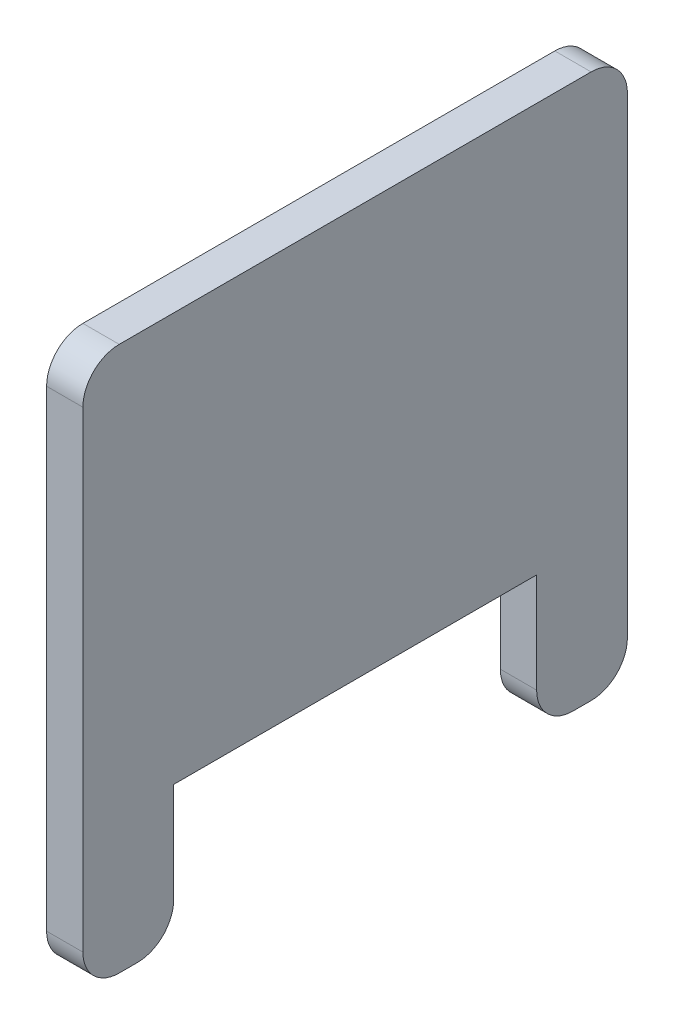
ISO-10303-21;
HEADER;
FILE_DESCRIPTION(('STEP AP214'),'2;1');
FILE_NAME('part.step','',(''),(''),'','','');
FILE_SCHEMA(('AUTOMOTIVE_DESIGN { 1 0 10303 214 1 1 1 1 }'));
ENDSEC;
DATA;
#1=APPLICATION_CONTEXT('core data for automotive mechanical design processes');
#2=APPLICATION_PROTOCOL_DEFINITION('international standard','automotive_design',2000,#1);
#3=PRODUCT_CONTEXT('',#1,'mechanical');
#4=PRODUCT('Part','Part','',(#3));
#5=PRODUCT_RELATED_PRODUCT_CATEGORY('part','',(#4));
#6=PRODUCT_DEFINITION_FORMATION('','',#4);
#7=PRODUCT_DEFINITION_CONTEXT('part definition',#1,'design');
#8=PRODUCT_DEFINITION('design','',#6,#7);
#9=PRODUCT_DEFINITION_SHAPE('','',#8);
#10=(LENGTH_UNIT() NAMED_UNIT(*) SI_UNIT(.MILLI.,.METRE.));
#11=(NAMED_UNIT(*) PLANE_ANGLE_UNIT() SI_UNIT($,.RADIAN.));
#12=(NAMED_UNIT(*) SI_UNIT($,.STERADIAN.) SOLID_ANGLE_UNIT());
#13=UNCERTAINTY_MEASURE_WITH_UNIT(LENGTH_MEASURE(1.E-05),#10,'distance_accuracy_value','');
#14=(GEOMETRIC_REPRESENTATION_CONTEXT(3) GLOBAL_UNCERTAINTY_ASSIGNED_CONTEXT((#13)) GLOBAL_UNIT_ASSIGNED_CONTEXT((#10,
#11,#12)) REPRESENTATION_CONTEXT('',''));
#15=CARTESIAN_POINT('',(0.,0.,0.));
#16=DIRECTION('',(0.,0.,1.));
#17=DIRECTION('',(1.,0.,0.));
#18=AXIS2_PLACEMENT_3D('',#15,#16,#17);
#19=CARTESIAN_POINT('',(10.,37.5,-150.));
#20=DIRECTION('',(0.,1.,0.));
#21=DIRECTION('',(0.,0.,1.));
#22=AXIS2_PLACEMENT_3D('',#19,#20,#21);
#23=PLANE('',#22);
#24=DIRECTION('',(0.,0.,-1.));
#25=VECTOR('',#24,1.);
#26=CARTESIAN_POINT('',(0.,37.5,-150.));
#27=LINE('',#26,#25);
#28=CARTESIAN_POINT('',(0.,37.5,-135.));
#29=VERTEX_POINT('',#28);
#30=CARTESIAN_POINT('',(0.,37.5,-140.));
#31=VERTEX_POINT('',#30);
#32=EDGE_CURVE('E185',#29,#31,#27,.T.);
#33=ORIENTED_EDGE('',*,*,#32,.T.);
#34=DIRECTION('',(-1.,0.,0.));
#35=VECTOR('',#34,1.);
#36=CARTESIAN_POINT('',(10.,37.5,-140.));
#37=LINE('',#36,#35);
#38=CARTESIAN_POINT('',(10.,37.5,-140.));
#39=VERTEX_POINT('',#38);
#40=EDGE_CURVE('E213',#31,#39,#37,.F.);
#41=ORIENTED_EDGE('',*,*,#40,.T.);
#42=DIRECTION('',(0.,0.,-1.));
#43=VECTOR('',#42,1.);
#44=CARTESIAN_POINT('',(10.,37.5,-150.));
#45=LINE('',#44,#43);
#46=CARTESIAN_POINT('',(10.,37.5,-135.));
#47=VERTEX_POINT('',#46);
#48=EDGE_CURVE('E172',#47,#39,#45,.T.);
#49=ORIENTED_EDGE('',*,*,#48,.F.);
#50=DIRECTION('',(-1.,0.,0.));
#51=VECTOR('',#50,1.);
#52=CARTESIAN_POINT('',(10.,37.5,-135.));
#53=LINE('',#52,#51);
#54=EDGE_CURVE('E210',#47,#29,#53,.T.);
#55=ORIENTED_EDGE('',*,*,#54,.T.);
#56=EDGE_LOOP('',(#33,#41,#49,#55));
#57=FACE_BOUND('',#56,.T.);
#58=ADVANCED_FACE('F33',(#57),#23,.F.);
#59=CARTESIAN_POINT('',(10.,187.5,0.));
#60=DIRECTION('',(0.,0.,-1.));
#61=DIRECTION('',(-1.,0.,0.));
#62=AXIS2_PLACEMENT_3D('',#59,#60,#61);
#63=PLANE('',#62);
#64=DIRECTION('',(0.,-1.,0.));
#65=VECTOR('',#64,1.);
#66=CARTESIAN_POINT('',(0.,187.5,0.));
#67=LINE('',#66,#65);
#68=CARTESIAN_POINT('',(0.,177.5,0.));
#69=VERTEX_POINT('',#68);
#70=CARTESIAN_POINT('',(0.,47.5,0.));
#71=VERTEX_POINT('',#70);
#72=EDGE_CURVE('E167',#69,#71,#67,.T.);
#73=ORIENTED_EDGE('',*,*,#72,.T.);
#74=DIRECTION('',(-1.,0.,0.));
#75=VECTOR('',#74,1.);
#76=CARTESIAN_POINT('',(10.,47.5,0.));
#77=LINE('',#76,#75);
#78=CARTESIAN_POINT('',(10.,47.5,0.));
#79=VERTEX_POINT('',#78);
#80=EDGE_CURVE('E237',#71,#79,#77,.F.);
#81=ORIENTED_EDGE('',*,*,#80,.T.);
#82=DIRECTION('',(0.,-1.,0.));
#83=VECTOR('',#82,1.);
#84=CARTESIAN_POINT('',(10.,187.5,0.));
#85=LINE('',#84,#83);
#86=CARTESIAN_POINT('',(10.,177.5,0.));
#87=VERTEX_POINT('',#86);
#88=EDGE_CURVE('E169',#87,#79,#85,.T.);
#89=ORIENTED_EDGE('',*,*,#88,.F.);
#90=DIRECTION('',(-1.,0.,0.));
#91=VECTOR('',#90,1.);
#92=CARTESIAN_POINT('',(10.,177.5,0.));
#93=LINE('',#92,#91);
#94=EDGE_CURVE('E234',#87,#69,#93,.T.);
#95=ORIENTED_EDGE('',*,*,#94,.T.);
#96=EDGE_LOOP('',(#73,#81,#89,#95));
#97=FACE_BOUND('',#96,.T.);
#98=ADVANCED_FACE('F251',(#97),#63,.F.);
#99=CARTESIAN_POINT('',(0.,37.5,-10.));
#100=VERTEX_POINT('',#99);
#101=CARTESIAN_POINT('',(0.,37.5,-15.));
#102=VERTEX_POINT('',#101);
#103=EDGE_CURVE('E188',#100,#102,#27,.T.);
#104=ORIENTED_EDGE('',*,*,#103,.T.);
#105=DIRECTION('',(-1.,0.,0.));
#106=VECTOR('',#105,1.);
#107=CARTESIAN_POINT('',(10.,37.5,-15.));
#108=LINE('',#107,#106);
#109=CARTESIAN_POINT('',(10.,37.5,-15.));
#110=VERTEX_POINT('',#109);
#111=EDGE_CURVE('E56',#102,#110,#108,.F.);
#112=ORIENTED_EDGE('',*,*,#111,.T.);
#113=CARTESIAN_POINT('',(10.,37.5,-10.));
#114=VERTEX_POINT('',#113);
#115=EDGE_CURVE('E174',#114,#110,#45,.T.);
#116=ORIENTED_EDGE('',*,*,#115,.F.);
#117=DIRECTION('',(-1.,0.,0.));
#118=VECTOR('',#117,1.);
#119=CARTESIAN_POINT('',(10.,37.5,-10.));
#120=LINE('',#119,#118);
#121=EDGE_CURVE('E230',#114,#100,#120,.T.);
#122=ORIENTED_EDGE('',*,*,#121,.T.);
#123=EDGE_LOOP('',(#104,#112,#116,#122));
#124=FACE_BOUND('',#123,.T.);
#125=ADVANCED_FACE('F261',(#124),#23,.F.);
#126=CARTESIAN_POINT('',(10.,187.5,-150.));
#127=DIRECTION('',(0.,0.,1.));
#128=DIRECTION('',(1.,0.,0.));
#129=AXIS2_PLACEMENT_3D('',#126,#127,#128);
#130=PLANE('',#129);
#131=DIRECTION('',(0.,1.,0.));
#132=VECTOR('',#131,1.);
#133=CARTESIAN_POINT('',(10.,187.5,-150.));
#134=LINE('',#133,#132);
#135=CARTESIAN_POINT('',(10.,47.5,-150.));
#136=VERTEX_POINT('',#135);
#137=CARTESIAN_POINT('',(10.,177.5,-150.));
#138=VERTEX_POINT('',#137);
#139=EDGE_CURVE('E176',#136,#138,#134,.T.);
#140=ORIENTED_EDGE('',*,*,#139,.F.);
#141=DIRECTION('',(-1.,0.,0.));
#142=VECTOR('',#141,1.);
#143=CARTESIAN_POINT('',(10.,47.5,-150.));
#144=LINE('',#143,#142);
#145=CARTESIAN_POINT('',(0.,47.5,-150.));
#146=VERTEX_POINT('',#145);
#147=EDGE_CURVE('E195',#136,#146,#144,.T.);
#148=ORIENTED_EDGE('',*,*,#147,.T.);
#149=DIRECTION('',(0.,1.,0.));
#150=VECTOR('',#149,1.);
#151=CARTESIAN_POINT('',(0.,187.5,-150.));
#152=LINE('',#151,#150);
#153=CARTESIAN_POINT('',(0.,177.5,-150.));
#154=VERTEX_POINT('',#153);
#155=EDGE_CURVE('E189',#146,#154,#152,.T.);
#156=ORIENTED_EDGE('',*,*,#155,.T.);
#157=DIRECTION('',(-1.,0.,0.));
#158=VECTOR('',#157,1.);
#159=CARTESIAN_POINT('',(10.,177.5,-150.));
#160=LINE('',#159,#158);
#161=EDGE_CURVE('E182',#154,#138,#160,.F.);
#162=ORIENTED_EDGE('',*,*,#161,.T.);
#163=EDGE_LOOP('',(#140,#148,#156,#162));
#164=FACE_BOUND('',#163,.T.);
#165=ADVANCED_FACE('F282',(#164),#130,.F.);
#166=CARTESIAN_POINT('',(10.,187.5,-150.));
#167=DIRECTION('',(0.,-1.,0.));
#168=DIRECTION('',(0.,0.,-1.));
#169=AXIS2_PLACEMENT_3D('',#166,#167,#168);
#170=PLANE('',#169);
#171=DIRECTION('',(0.,0.,1.));
#172=VECTOR('',#171,1.);
#173=CARTESIAN_POINT('',(10.,187.5,-150.));
#174=LINE('',#173,#172);
#175=CARTESIAN_POINT('',(10.,187.5,-140.));
#176=VERTEX_POINT('',#175);
#177=CARTESIAN_POINT('',(10.,187.5,-10.));
#178=VERTEX_POINT('',#177);
#179=EDGE_CURVE('E179',#176,#178,#174,.T.);
#180=ORIENTED_EDGE('',*,*,#179,.F.);
#181=DIRECTION('',(-1.,0.,0.));
#182=VECTOR('',#181,1.);
#183=CARTESIAN_POINT('',(10.,187.5,-140.));
#184=LINE('',#183,#182);
#185=CARTESIAN_POINT('',(0.,187.5,-140.));
#186=VERTEX_POINT('',#185);
#187=EDGE_CURVE('E11',#176,#186,#184,.T.);
#188=ORIENTED_EDGE('',*,*,#187,.T.);
#189=DIRECTION('',(0.,0.,1.));
#190=VECTOR('',#189,1.);
#191=CARTESIAN_POINT('',(0.,187.5,-150.));
#192=LINE('',#191,#190);
#193=CARTESIAN_POINT('',(0.,187.5,-10.));
#194=VERTEX_POINT('',#193);
#195=EDGE_CURVE('E173',#186,#194,#192,.T.);
#196=ORIENTED_EDGE('',*,*,#195,.T.);
#197=DIRECTION('',(-1.,0.,0.));
#198=VECTOR('',#197,1.);
#199=CARTESIAN_POINT('',(10.,187.5,-10.));
#200=LINE('',#199,#198);
#201=EDGE_CURVE('E41',#194,#178,#200,.F.);
#202=ORIENTED_EDGE('',*,*,#201,.T.);
#203=EDGE_LOOP('',(#180,#188,#196,#202));
#204=FACE_BOUND('',#203,.T.);
#205=ADVANCED_FACE('F241',(#204),#170,.F.);
#206=CARTESIAN_POINT('',(10.,0.,0.));
#207=DIRECTION('',(-1.,0.,0.));
#208=DIRECTION('',(0.,0.,1.));
#209=AXIS2_PLACEMENT_3D('',#206,#207,#208);
#210=PLANE('',#209);
#211=ORIENTED_EDGE('',*,*,#48,.T.);
#212=CARTESIAN_POINT('',(10.,47.5,-140.));
#213=DIRECTION('',(-1.,0.,0.));
#214=DIRECTION('',(0.,0.,1.));
#215=AXIS2_PLACEMENT_3D('',#212,#213,#214);
#216=CIRCLE('',#215,10.);
#217=EDGE_CURVE('E224',#39,#136,#216,.F.);
#218=ORIENTED_EDGE('',*,*,#217,.T.);
#219=ORIENTED_EDGE('',*,*,#139,.T.);
#220=CARTESIAN_POINT('',(10.,177.5,-140.));
#221=DIRECTION('',(-1.,0.,0.));
#222=DIRECTION('',(0.,0.,1.));
#223=AXIS2_PLACEMENT_3D('',#220,#221,#222);
#224=CIRCLE('',#223,10.);
#225=EDGE_CURVE('E217',#138,#176,#224,.F.);
#226=ORIENTED_EDGE('',*,*,#225,.T.);
#227=ORIENTED_EDGE('',*,*,#179,.T.);
#228=CARTESIAN_POINT('',(10.,177.5,-10.));
#229=DIRECTION('',(-1.,0.,0.));
#230=DIRECTION('',(0.,0.,1.));
#231=AXIS2_PLACEMENT_3D('',#228,#229,#230);
#232=CIRCLE('',#231,10.);
#233=EDGE_CURVE('E215',#178,#87,#232,.F.);
#234=ORIENTED_EDGE('',*,*,#233,.T.);
#235=ORIENTED_EDGE('',*,*,#88,.T.);
#236=CARTESIAN_POINT('',(10.,47.5,-10.));
#237=DIRECTION('',(-1.,0.,0.));
#238=DIRECTION('',(0.,0.,1.));
#239=AXIS2_PLACEMENT_3D('',#236,#237,#238);
#240=CIRCLE('',#239,10.);
#241=EDGE_CURVE('E219',#79,#114,#240,.F.);
#242=ORIENTED_EDGE('',*,*,#241,.T.);
#243=ORIENTED_EDGE('',*,*,#115,.T.);
#244=CARTESIAN_POINT('',(10.,47.5,-15.));
#245=DIRECTION('',(-1.,0.,0.));
#246=DIRECTION('',(0.,0.,1.));
#247=AXIS2_PLACEMENT_3D('',#244,#245,#246);
#248=CIRCLE('',#247,10.);
#249=CARTESIAN_POINT('',(10.,47.5,-25.));
#250=VERTEX_POINT('',#249);
#251=EDGE_CURVE('E48',#110,#250,#248,.F.);
#252=ORIENTED_EDGE('',*,*,#251,.T.);
#253=DIRECTION('',(0.,1.,0.));
#254=VECTOR('',#253,1.);
#255=CARTESIAN_POINT('',(10.,37.5,-25.));
#256=LINE('',#255,#254);
#257=CARTESIAN_POINT('',(10.,75.,-25.));
#258=VERTEX_POINT('',#257);
#259=EDGE_CURVE('E134',#250,#258,#256,.T.);
#260=ORIENTED_EDGE('',*,*,#259,.T.);
#261=DIRECTION('',(0.,0.,-1.));
#262=VECTOR('',#261,1.);
#263=CARTESIAN_POINT('',(10.,75.,-125.));
#264=LINE('',#263,#262);
#265=CARTESIAN_POINT('',(10.,75.,-125.));
#266=VERTEX_POINT('',#265);
#267=EDGE_CURVE('E140',#258,#266,#264,.T.);
#268=ORIENTED_EDGE('',*,*,#267,.T.);
#269=DIRECTION('',(0.,-1.,0.));
#270=VECTOR('',#269,1.);
#271=CARTESIAN_POINT('',(10.,37.5,-125.));
#272=LINE('',#271,#270);
#273=CARTESIAN_POINT('',(10.,47.5,-125.));
#274=VERTEX_POINT('',#273);
#275=EDGE_CURVE('E144',#266,#274,#272,.T.);
#276=ORIENTED_EDGE('',*,*,#275,.T.);
#277=CARTESIAN_POINT('',(10.,47.5,-135.));
#278=DIRECTION('',(-1.,0.,0.));
#279=DIRECTION('',(0.,0.,1.));
#280=AXIS2_PLACEMENT_3D('',#277,#278,#279);
#281=CIRCLE('',#280,10.);
#282=EDGE_CURVE('E222',#274,#47,#281,.F.);
#283=ORIENTED_EDGE('',*,*,#282,.T.);
#284=EDGE_LOOP('',(#211,#218,#219,#226,#227,#234,#235,#242,#243,#252,#260,#268,#276,#283));
#285=FACE_BOUND('',#284,.T.);
#286=ADVANCED_FACE('F137',(#285),#210,.F.);
#287=CARTESIAN_POINT('',(0.,0.,0.));
#288=DIRECTION('',(-1.,0.,0.));
#289=DIRECTION('',(0.,0.,1.));
#290=AXIS2_PLACEMENT_3D('',#287,#288,#289);
#291=PLANE('',#290);
#292=ORIENTED_EDGE('',*,*,#155,.F.);
#293=CARTESIAN_POINT('',(0.,47.5,-140.));
#294=DIRECTION('',(-1.,0.,0.));
#295=DIRECTION('',(0.,0.,1.));
#296=AXIS2_PLACEMENT_3D('',#293,#294,#295);
#297=CIRCLE('',#296,10.);
#298=EDGE_CURVE('E208',#146,#31,#297,.T.);
#299=ORIENTED_EDGE('',*,*,#298,.T.);
#300=ORIENTED_EDGE('',*,*,#32,.F.);
#301=CARTESIAN_POINT('',(0.,47.5,-135.));
#302=DIRECTION('',(-1.,0.,0.));
#303=DIRECTION('',(0.,0.,1.));
#304=AXIS2_PLACEMENT_3D('',#301,#302,#303);
#305=CIRCLE('',#304,10.);
#306=CARTESIAN_POINT('',(0.,47.5,-125.));
#307=VERTEX_POINT('',#306);
#308=EDGE_CURVE('E206',#29,#307,#305,.T.);
#309=ORIENTED_EDGE('',*,*,#308,.T.);
#310=DIRECTION('',(0.,-1.,0.));
#311=VECTOR('',#310,1.);
#312=CARTESIAN_POINT('',(0.,37.5,-125.));
#313=LINE('',#312,#311);
#314=CARTESIAN_POINT('',(0.,75.,-125.));
#315=VERTEX_POINT('',#314);
#316=EDGE_CURVE('E161',#315,#307,#313,.T.);
#317=ORIENTED_EDGE('',*,*,#316,.F.);
#318=DIRECTION('',(0.,0.,-1.));
#319=VECTOR('',#318,1.);
#320=CARTESIAN_POINT('',(0.,75.,-125.));
#321=LINE('',#320,#319);
#322=CARTESIAN_POINT('',(0.,75.,-25.));
#323=VERTEX_POINT('',#322);
#324=EDGE_CURVE('E165',#323,#315,#321,.T.);
#325=ORIENTED_EDGE('',*,*,#324,.F.);
#326=DIRECTION('',(0.,1.,0.));
#327=VECTOR('',#326,1.);
#328=CARTESIAN_POINT('',(0.,37.5,-25.));
#329=LINE('',#328,#327);
#330=CARTESIAN_POINT('',(0.,47.5,-25.));
#331=VERTEX_POINT('',#330);
#332=EDGE_CURVE('E150',#331,#323,#329,.T.);
#333=ORIENTED_EDGE('',*,*,#332,.F.);
#334=CARTESIAN_POINT('',(0.,47.5,-15.));
#335=DIRECTION('',(-1.,0.,0.));
#336=DIRECTION('',(0.,0.,1.));
#337=AXIS2_PLACEMENT_3D('',#334,#335,#336);
#338=CIRCLE('',#337,10.);
#339=EDGE_CURVE('E204',#331,#102,#338,.T.);
#340=ORIENTED_EDGE('',*,*,#339,.T.);
#341=ORIENTED_EDGE('',*,*,#103,.F.);
#342=CARTESIAN_POINT('',(0.,47.5,-10.));
#343=DIRECTION('',(-1.,0.,0.));
#344=DIRECTION('',(0.,0.,1.));
#345=AXIS2_PLACEMENT_3D('',#342,#343,#344);
#346=CIRCLE('',#345,10.);
#347=EDGE_CURVE('E202',#100,#71,#346,.T.);
#348=ORIENTED_EDGE('',*,*,#347,.T.);
#349=ORIENTED_EDGE('',*,*,#72,.F.);
#350=CARTESIAN_POINT('',(0.,177.5,-10.));
#351=DIRECTION('',(-1.,0.,0.));
#352=DIRECTION('',(0.,0.,1.));
#353=AXIS2_PLACEMENT_3D('',#350,#351,#352);
#354=CIRCLE('',#353,10.);
#355=EDGE_CURVE('E198',#69,#194,#354,.T.);
#356=ORIENTED_EDGE('',*,*,#355,.T.);
#357=ORIENTED_EDGE('',*,*,#195,.F.);
#358=CARTESIAN_POINT('',(0.,177.5,-140.));
#359=DIRECTION('',(-1.,0.,0.));
#360=DIRECTION('',(0.,0.,1.));
#361=AXIS2_PLACEMENT_3D('',#358,#359,#360);
#362=CIRCLE('',#361,10.);
#363=EDGE_CURVE('E200',#186,#154,#362,.T.);
#364=ORIENTED_EDGE('',*,*,#363,.T.);
#365=EDGE_LOOP('',(#292,#299,#300,#309,#317,#325,#333,#340,#341,#348,#349,#356,#357,#364));
#366=FACE_BOUND('',#365,.T.);
#367=ADVANCED_FACE('F255',(#366),#291,.T.);
#368=CARTESIAN_POINT('',(10.,37.5,-125.));
#369=DIRECTION('',(0.,0.,-1.));
#370=DIRECTION('',(-1.,0.,0.));
#371=AXIS2_PLACEMENT_3D('',#368,#369,#370);
#372=PLANE('',#371);
#373=ORIENTED_EDGE('',*,*,#316,.T.);
#374=DIRECTION('',(-1.,0.,0.));
#375=VECTOR('',#374,1.);
#376=CARTESIAN_POINT('',(10.,47.5,-125.));
#377=LINE('',#376,#375);
#378=EDGE_CURVE('E226',#307,#274,#377,.F.);
#379=ORIENTED_EDGE('',*,*,#378,.T.);
#380=ORIENTED_EDGE('',*,*,#275,.F.);
#381=DIRECTION('',(-1.,0.,0.));
#382=VECTOR('',#381,1.);
#383=CARTESIAN_POINT('',(10.,75.,-125.));
#384=LINE('',#383,#382);
#385=EDGE_CURVE('E154',#266,#315,#384,.T.);
#386=ORIENTED_EDGE('',*,*,#385,.T.);
#387=EDGE_LOOP('',(#373,#379,#380,#386));
#388=FACE_BOUND('',#387,.T.);
#389=ADVANCED_FACE('F268',(#388),#372,.F.);
#390=CARTESIAN_POINT('',(10.,75.,-125.));
#391=DIRECTION('',(0.,1.,0.));
#392=DIRECTION('',(0.,0.,1.));
#393=AXIS2_PLACEMENT_3D('',#390,#391,#392);
#394=PLANE('',#393);
#395=ORIENTED_EDGE('',*,*,#324,.T.);
#396=ORIENTED_EDGE('',*,*,#385,.F.);
#397=ORIENTED_EDGE('',*,*,#267,.F.);
#398=DIRECTION('',(-1.,0.,0.));
#399=VECTOR('',#398,1.);
#400=CARTESIAN_POINT('',(10.,75.,-25.));
#401=LINE('',#400,#399);
#402=EDGE_CURVE('E147',#258,#323,#401,.T.);
#403=ORIENTED_EDGE('',*,*,#402,.T.);
#404=EDGE_LOOP('',(#395,#396,#397,#403));
#405=FACE_BOUND('',#404,.T.);
#406=ADVANCED_FACE('F156',(#405),#394,.F.);
#407=CARTESIAN_POINT('',(10.,37.5,-25.));
#408=DIRECTION('',(0.,0.,1.));
#409=DIRECTION('',(1.,0.,0.));
#410=AXIS2_PLACEMENT_3D('',#407,#408,#409);
#411=PLANE('',#410);
#412=ORIENTED_EDGE('',*,*,#259,.F.);
#413=DIRECTION('',(-1.,0.,0.));
#414=VECTOR('',#413,1.);
#415=CARTESIAN_POINT('',(10.,47.5,-25.));
#416=LINE('',#415,#414);
#417=EDGE_CURVE('E228',#250,#331,#416,.T.);
#418=ORIENTED_EDGE('',*,*,#417,.T.);
#419=ORIENTED_EDGE('',*,*,#332,.T.);
#420=ORIENTED_EDGE('',*,*,#402,.F.);
#421=EDGE_LOOP('',(#412,#418,#419,#420));
#422=FACE_BOUND('',#421,.T.);
#423=ADVANCED_FACE('F148',(#422),#411,.F.);
#424=CARTESIAN_POINT('',(10.,47.5,-140.));
#425=DIRECTION('',(-1.,0.,0.));
#426=DIRECTION('',(0.,0.,1.));
#427=AXIS2_PLACEMENT_3D('',#424,#425,#426);
#428=CYLINDRICAL_SURFACE('',#427,10.);
#429=ORIENTED_EDGE('',*,*,#217,.F.);
#430=ORIENTED_EDGE('',*,*,#40,.F.);
#431=ORIENTED_EDGE('',*,*,#298,.F.);
#432=ORIENTED_EDGE('',*,*,#147,.F.);
#433=EDGE_LOOP('',(#429,#430,#431,#432));
#434=FACE_BOUND('',#433,.T.);
#435=ADVANCED_FACE('F278',(#434),#428,.T.);
#436=CARTESIAN_POINT('',(10.,47.5,-135.));
#437=DIRECTION('',(-1.,0.,0.));
#438=DIRECTION('',(0.,0.,1.));
#439=AXIS2_PLACEMENT_3D('',#436,#437,#438);
#440=CYLINDRICAL_SURFACE('',#439,10.);
#441=ORIENTED_EDGE('',*,*,#282,.F.);
#442=ORIENTED_EDGE('',*,*,#378,.F.);
#443=ORIENTED_EDGE('',*,*,#308,.F.);
#444=ORIENTED_EDGE('',*,*,#54,.F.);
#445=EDGE_LOOP('',(#441,#442,#443,#444));
#446=FACE_BOUND('',#445,.T.);
#447=ADVANCED_FACE('F271',(#446),#440,.T.);
#448=CARTESIAN_POINT('',(10.,47.5,-15.));
#449=DIRECTION('',(-1.,0.,0.));
#450=DIRECTION('',(0.,0.,1.));
#451=AXIS2_PLACEMENT_3D('',#448,#449,#450);
#452=CYLINDRICAL_SURFACE('',#451,10.);
#453=ORIENTED_EDGE('',*,*,#251,.F.);
#454=ORIENTED_EDGE('',*,*,#111,.F.);
#455=ORIENTED_EDGE('',*,*,#339,.F.);
#456=ORIENTED_EDGE('',*,*,#417,.F.);
#457=EDGE_LOOP('',(#453,#454,#455,#456));
#458=FACE_BOUND('',#457,.T.);
#459=ADVANCED_FACE('F263',(#458),#452,.T.);
#460=CARTESIAN_POINT('',(10.,47.5,-10.));
#461=DIRECTION('',(-1.,0.,0.));
#462=DIRECTION('',(0.,0.,1.));
#463=AXIS2_PLACEMENT_3D('',#460,#461,#462);
#464=CYLINDRICAL_SURFACE('',#463,10.);
#465=ORIENTED_EDGE('',*,*,#241,.F.);
#466=ORIENTED_EDGE('',*,*,#80,.F.);
#467=ORIENTED_EDGE('',*,*,#347,.F.);
#468=ORIENTED_EDGE('',*,*,#121,.F.);
#469=EDGE_LOOP('',(#465,#466,#467,#468));
#470=FACE_BOUND('',#469,.T.);
#471=ADVANCED_FACE('F260',(#470),#464,.T.);
#472=CARTESIAN_POINT('',(10.,177.5,-140.));
#473=DIRECTION('',(-1.,0.,0.));
#474=DIRECTION('',(0.,0.,1.));
#475=AXIS2_PLACEMENT_3D('',#472,#473,#474);
#476=CYLINDRICAL_SURFACE('',#475,10.);
#477=ORIENTED_EDGE('',*,*,#225,.F.);
#478=ORIENTED_EDGE('',*,*,#161,.F.);
#479=ORIENTED_EDGE('',*,*,#363,.F.);
#480=ORIENTED_EDGE('',*,*,#187,.F.);
#481=EDGE_LOOP('',(#477,#478,#479,#480));
#482=FACE_BOUND('',#481,.T.);
#483=ADVANCED_FACE('F285',(#482),#476,.T.);
#484=CARTESIAN_POINT('',(10.,177.5,-10.));
#485=DIRECTION('',(-1.,0.,0.));
#486=DIRECTION('',(0.,0.,1.));
#487=AXIS2_PLACEMENT_3D('',#484,#485,#486);
#488=CYLINDRICAL_SURFACE('',#487,10.);
#489=ORIENTED_EDGE('',*,*,#233,.F.);
#490=ORIENTED_EDGE('',*,*,#201,.F.);
#491=ORIENTED_EDGE('',*,*,#355,.F.);
#492=ORIENTED_EDGE('',*,*,#94,.F.);
#493=EDGE_LOOP('',(#489,#490,#491,#492));
#494=FACE_BOUND('',#493,.T.);
#495=ADVANCED_FACE('F35',(#494),#488,.T.);
#496=CLOSED_SHELL('',(#58,#98,#125,#165,#205,#286,#367,#389,#406,#423,#435,#447,#459,#471,#483,#495));
#497=MANIFOLD_SOLID_BREP('B2',#496);
#498=ADVANCED_BREP_SHAPE_REPRESENTATION('',(#18,#497),#14);
#499=SHAPE_DEFINITION_REPRESENTATION(#9,#498);
ENDSEC;
END-ISO-10303-21;
